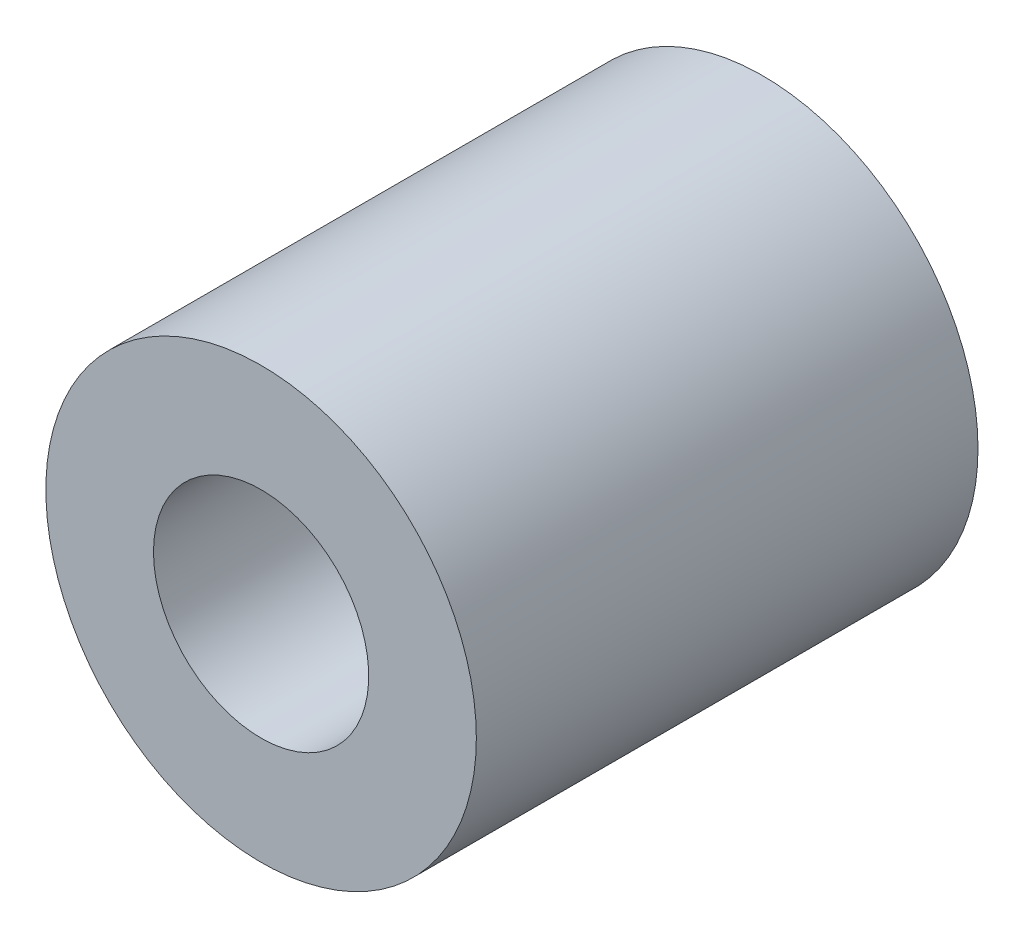
ISO-10303-21;
HEADER;
FILE_DESCRIPTION(('STEP AP214'),'2;1');
FILE_NAME('part.step','',(''),(''),'','','');
FILE_SCHEMA(('AUTOMOTIVE_DESIGN { 1 0 10303 214 1 1 1 1 }'));
ENDSEC;
DATA;
#1=APPLICATION_CONTEXT('core data for automotive mechanical design processes');
#2=APPLICATION_PROTOCOL_DEFINITION('international standard','automotive_design',2000,#1);
#3=PRODUCT_CONTEXT('',#1,'mechanical');
#4=PRODUCT('Part','Part','',(#3));
#5=PRODUCT_RELATED_PRODUCT_CATEGORY('part','',(#4));
#6=PRODUCT_DEFINITION_FORMATION('','',#4);
#7=PRODUCT_DEFINITION_CONTEXT('part definition',#1,'design');
#8=PRODUCT_DEFINITION('design','',#6,#7);
#9=PRODUCT_DEFINITION_SHAPE('','',#8);
#10=(LENGTH_UNIT() NAMED_UNIT(*) SI_UNIT(.MILLI.,.METRE.));
#11=(NAMED_UNIT(*) PLANE_ANGLE_UNIT() SI_UNIT($,.RADIAN.));
#12=(NAMED_UNIT(*) SI_UNIT($,.STERADIAN.) SOLID_ANGLE_UNIT());
#13=UNCERTAINTY_MEASURE_WITH_UNIT(LENGTH_MEASURE(1.E-05),#10,'distance_accuracy_value','');
#14=(GEOMETRIC_REPRESENTATION_CONTEXT(3) GLOBAL_UNCERTAINTY_ASSIGNED_CONTEXT((#13)) GLOBAL_UNIT_ASSIGNED_CONTEXT((#10,
#11,#12)) REPRESENTATION_CONTEXT('',''));
#15=CARTESIAN_POINT('',(0.,0.,0.));
#16=DIRECTION('',(0.,0.,1.));
#17=DIRECTION('',(1.,0.,0.));
#18=AXIS2_PLACEMENT_3D('',#15,#16,#17);
#19=CARTESIAN_POINT('',(0.,0.,6.985));
#20=DIRECTION('',(0.,0.,-1.));
#21=DIRECTION('',(-1.,0.,0.));
#22=AXIS2_PLACEMENT_3D('',#19,#20,#21);
#23=CYLINDRICAL_SURFACE('',#22,1.4986);
#24=CARTESIAN_POINT('',(0.,0.,0.));
#25=DIRECTION('',(0.,0.,-1.));
#26=DIRECTION('',(-1.,0.,0.));
#27=AXIS2_PLACEMENT_3D('',#24,#25,#26);
#28=CIRCLE('',#27,1.4986);
#29=CARTESIAN_POINT('',(-1.4986,0.,0.));
#30=VERTEX_POINT('',#29);
#31=EDGE_CURVE('E27',#30,#30,#28,.T.);
#32=ORIENTED_EDGE('',*,*,#31,.T.);
#33=EDGE_LOOP('',(#32));
#34=FACE_BOUND('',#33,.T.);
#35=CARTESIAN_POINT('',(0.,0.,6.985));
#36=DIRECTION('',(0.,0.,-1.));
#37=DIRECTION('',(-1.,0.,0.));
#38=AXIS2_PLACEMENT_3D('',#35,#36,#37);
#39=CIRCLE('',#38,1.4986);
#40=CARTESIAN_POINT('',(-1.4986,0.,6.985));
#41=VERTEX_POINT('',#40);
#42=EDGE_CURVE('E18',#41,#41,#39,.T.);
#43=ORIENTED_EDGE('',*,*,#42,.F.);
#44=EDGE_LOOP('',(#43));
#45=FACE_BOUND('',#44,.T.);
#46=ADVANCED_FACE('F15',(#34,#45),#23,.F.);
#47=CARTESIAN_POINT('',(0.,0.,6.985));
#48=DIRECTION('',(0.,0.,1.));
#49=DIRECTION('',(1.,0.,0.));
#50=AXIS2_PLACEMENT_3D('',#47,#48,#49);
#51=PLANE('',#50);
#52=ORIENTED_EDGE('',*,*,#42,.T.);
#53=EDGE_LOOP('',(#52));
#54=FACE_BOUND('',#53,.T.);
#55=CARTESIAN_POINT('',(0.,0.,6.985));
#56=DIRECTION('',(0.,0.,1.));
#57=DIRECTION('',(1.,0.,0.));
#58=AXIS2_PLACEMENT_3D('',#55,#56,#57);
#59=CIRCLE('',#58,2.9972);
#60=CARTESIAN_POINT('',(2.9972,0.,6.985));
#61=VERTEX_POINT('',#60);
#62=EDGE_CURVE('E22',#61,#61,#59,.F.);
#63=ORIENTED_EDGE('',*,*,#62,.F.);
#64=EDGE_LOOP('',(#63));
#65=FACE_BOUND('',#64,.T.);
#66=ADVANCED_FACE('F35',(#54,#65),#51,.T.);
#67=CARTESIAN_POINT('',(0.,0.,0.));
#68=DIRECTION('',(0.,0.,1.));
#69=DIRECTION('',(1.,0.,0.));
#70=AXIS2_PLACEMENT_3D('',#67,#68,#69);
#71=PLANE('',#70);
#72=ORIENTED_EDGE('',*,*,#31,.F.);
#73=EDGE_LOOP('',(#72));
#74=FACE_BOUND('',#73,.T.);
#75=CARTESIAN_POINT('',(0.,0.,0.));
#76=DIRECTION('',(0.,0.,1.));
#77=DIRECTION('',(1.,0.,0.));
#78=AXIS2_PLACEMENT_3D('',#75,#76,#77);
#79=CIRCLE('',#78,2.9972);
#80=CARTESIAN_POINT('',(2.9972,0.,0.));
#81=VERTEX_POINT('',#80);
#82=EDGE_CURVE('E10',#81,#81,#79,.T.);
#83=ORIENTED_EDGE('',*,*,#82,.F.);
#84=EDGE_LOOP('',(#83));
#85=FACE_BOUND('',#84,.T.);
#86=ADVANCED_FACE('F43',(#74,#85),#71,.F.);
#87=CARTESIAN_POINT('',(0.,0.,0.));
#88=DIRECTION('',(0.,0.,1.));
#89=DIRECTION('',(1.,0.,0.));
#90=AXIS2_PLACEMENT_3D('',#87,#88,#89);
#91=CYLINDRICAL_SURFACE('',#90,2.9972);
#92=ORIENTED_EDGE('',*,*,#62,.T.);
#93=EDGE_LOOP('',(#92));
#94=FACE_BOUND('',#93,.T.);
#95=ORIENTED_EDGE('',*,*,#82,.T.);
#96=EDGE_LOOP('',(#95));
#97=FACE_BOUND('',#96,.T.);
#98=ADVANCED_FACE('F44',(#94,#97),#91,.T.);
#99=CLOSED_SHELL('',(#46,#66,#86,#98));
#100=MANIFOLD_SOLID_BREP('B1',#99);
#101=ADVANCED_BREP_SHAPE_REPRESENTATION('',(#18,#100),#14);
#102=SHAPE_DEFINITION_REPRESENTATION(#9,#101);
ENDSEC;
END-ISO-10303-21;
